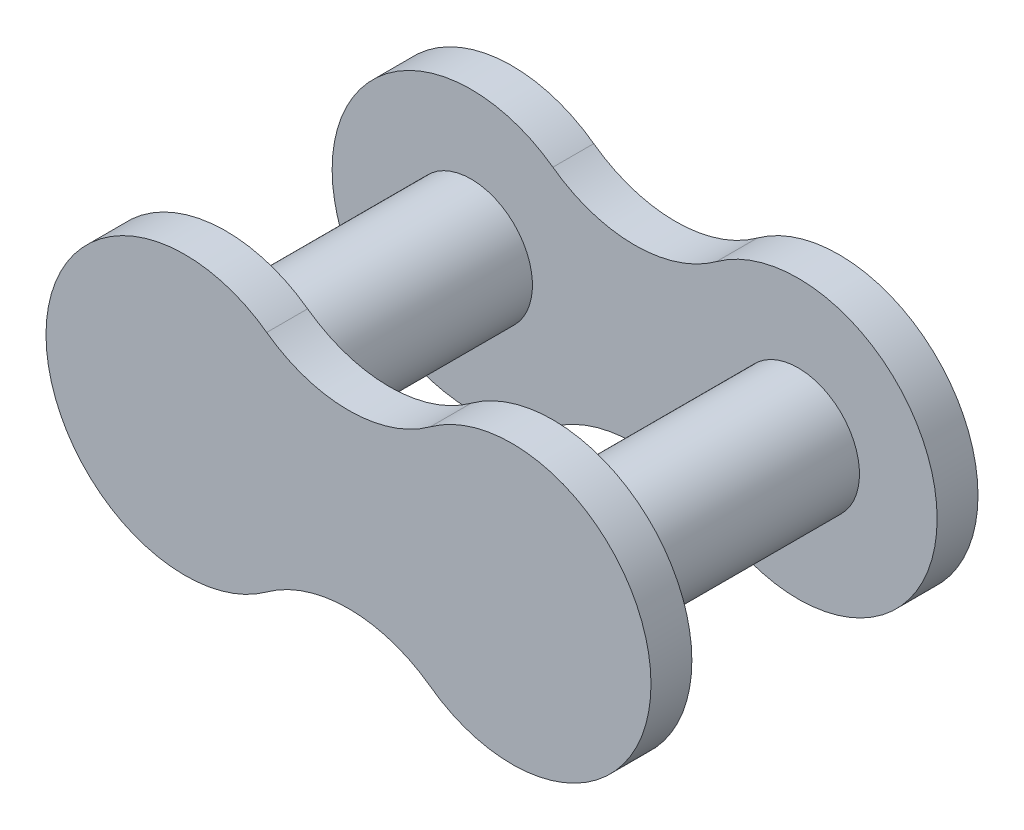
ISO-10303-21;
HEADER;
FILE_DESCRIPTION(('STEP AP214'),'2;1');
FILE_NAME('part.step','',(''),(''),'','','');
FILE_SCHEMA(('AUTOMOTIVE_DESIGN { 1 0 10303 214 1 1 1 1 }'));
ENDSEC;
DATA;
#1=APPLICATION_CONTEXT('core data for automotive mechanical design processes');
#2=APPLICATION_PROTOCOL_DEFINITION('international standard','automotive_design',2000,#1);
#3=PRODUCT_CONTEXT('',#1,'mechanical');
#4=PRODUCT('Part','Part','',(#3));
#5=PRODUCT_RELATED_PRODUCT_CATEGORY('part','',(#4));
#6=PRODUCT_DEFINITION_FORMATION('','',#4);
#7=PRODUCT_DEFINITION_CONTEXT('part definition',#1,'design');
#8=PRODUCT_DEFINITION('design','',#6,#7);
#9=PRODUCT_DEFINITION_SHAPE('','',#8);
#10=(LENGTH_UNIT() NAMED_UNIT(*) SI_UNIT(.MILLI.,.METRE.));
#11=(NAMED_UNIT(*) PLANE_ANGLE_UNIT() SI_UNIT($,.RADIAN.));
#12=(NAMED_UNIT(*) SI_UNIT($,.STERADIAN.) SOLID_ANGLE_UNIT());
#13=UNCERTAINTY_MEASURE_WITH_UNIT(LENGTH_MEASURE(1.E-05),#10,'distance_accuracy_value','');
#14=(GEOMETRIC_REPRESENTATION_CONTEXT(3) GLOBAL_UNCERTAINTY_ASSIGNED_CONTEXT((#13)) GLOBAL_UNIT_ASSIGNED_CONTEXT((#10,
#11,#12)) REPRESENTATION_CONTEXT('',''));
#15=CARTESIAN_POINT('',(0.,0.,0.));
#16=DIRECTION('',(0.,0.,1.));
#17=DIRECTION('',(1.,0.,0.));
#18=AXIS2_PLACEMENT_3D('',#15,#16,#17);
#19=CARTESIAN_POINT('',(9.525,-4.36490334944544,-0.79375));
#20=DIRECTION('',(0.,0.,1.));
#21=DIRECTION('',(1.,0.,0.));
#22=AXIS2_PLACEMENT_3D('',#19,#20,#21);
#23=CYLINDRICAL_SURFACE('',#22,2.69875);
#24=CARTESIAN_POINT('',(9.525,-4.36490334944544,0.));
#25=DIRECTION('',(0.,0.,-1.));
#26=DIRECTION('',(-1.,0.,0.));
#27=AXIS2_PLACEMENT_3D('',#24,#25,#26);
#28=CIRCLE('',#27,2.69875);
#29=CARTESIAN_POINT('',(11.1125,-2.18245167472272,0.));
#30=VERTEX_POINT('',#29);
#31=CARTESIAN_POINT('',(7.9375,-2.18245167472272,0.));
#32=VERTEX_POINT('',#31);
#33=EDGE_CURVE('E152',#30,#32,#28,.F.);
#34=ORIENTED_EDGE('',*,*,#33,.T.);
#35=DIRECTION('',(0.,0.,1.));
#36=VECTOR('',#35,1.);
#37=CARTESIAN_POINT('',(7.9375,-2.18245167472272,-0.79375));
#38=LINE('',#37,#36);
#39=CARTESIAN_POINT('',(7.9375,-2.18245167472272,-0.79375));
#40=VERTEX_POINT('',#39);
#41=EDGE_CURVE('E11',#40,#32,#38,.T.);
#42=ORIENTED_EDGE('',*,*,#41,.F.);
#43=CARTESIAN_POINT('',(9.525,-4.36490334944544,-0.79375));
#44=DIRECTION('',(0.,0.,-1.));
#45=DIRECTION('',(-1.,0.,0.));
#46=AXIS2_PLACEMENT_3D('',#43,#44,#45);
#47=CIRCLE('',#46,2.69875);
#48=CARTESIAN_POINT('',(11.1125,-2.18245167472272,-0.79375));
#49=VERTEX_POINT('',#48);
#50=EDGE_CURVE('E153',#49,#40,#47,.F.);
#51=ORIENTED_EDGE('',*,*,#50,.F.);
#52=DIRECTION('',(0.,0.,1.));
#53=VECTOR('',#52,1.);
#54=CARTESIAN_POINT('',(11.1125,-2.18245167472272,-0.79375));
#55=LINE('',#54,#53);
#56=EDGE_CURVE('E161',#49,#30,#55,.T.);
#57=ORIENTED_EDGE('',*,*,#56,.T.);
#58=EDGE_LOOP('',(#34,#42,#51,#57));
#59=FACE_BOUND('',#58,.T.);
#60=ADVANCED_FACE('F32',(#59),#23,.F.);
#61=CARTESIAN_POINT('',(6.35,0.,-0.79375));
#62=DIRECTION('',(0.,0.,1.));
#63=DIRECTION('',(1.,0.,0.));
#64=AXIS2_PLACEMENT_3D('',#61,#62,#63);
#65=CYLINDRICAL_SURFACE('',#64,2.69875);
#66=CARTESIAN_POINT('',(6.35,0.,0.));
#67=DIRECTION('',(0.,0.,-1.));
#68=DIRECTION('',(-1.,0.,0.));
#69=AXIS2_PLACEMENT_3D('',#66,#67,#68);
#70=CIRCLE('',#69,2.69875);
#71=CARTESIAN_POINT('',(7.9375,2.18245167472272,0.));
#72=VERTEX_POINT('',#71);
#73=EDGE_CURVE('E164',#32,#72,#70,.T.);
#74=ORIENTED_EDGE('',*,*,#73,.T.);
#75=DIRECTION('',(0.,0.,1.));
#76=VECTOR('',#75,1.);
#77=CARTESIAN_POINT('',(7.9375,2.18245167472272,-0.79375));
#78=LINE('',#77,#76);
#79=CARTESIAN_POINT('',(7.9375,2.18245167472272,-0.79375));
#80=VERTEX_POINT('',#79);
#81=EDGE_CURVE('E40',#80,#72,#78,.T.);
#82=ORIENTED_EDGE('',*,*,#81,.F.);
#83=CARTESIAN_POINT('',(6.35,0.,-0.79375));
#84=DIRECTION('',(0.,0.,-1.));
#85=DIRECTION('',(-1.,0.,0.));
#86=AXIS2_PLACEMENT_3D('',#83,#84,#85);
#87=CIRCLE('',#86,2.69875);
#88=EDGE_CURVE('E75',#40,#80,#87,.T.);
#89=ORIENTED_EDGE('',*,*,#88,.F.);
#90=ORIENTED_EDGE('',*,*,#41,.T.);
#91=EDGE_LOOP('',(#74,#82,#89,#90));
#92=FACE_BOUND('',#91,.T.);
#93=ADVANCED_FACE('F177',(#92),#65,.T.);
#94=CARTESIAN_POINT('',(9.525,4.36490334944544,-0.79375));
#95=DIRECTION('',(0.,0.,1.));
#96=DIRECTION('',(1.,0.,0.));
#97=AXIS2_PLACEMENT_3D('',#94,#95,#96);
#98=CYLINDRICAL_SURFACE('',#97,2.69875);
#99=CARTESIAN_POINT('',(9.525,4.36490334944544,0.));
#100=DIRECTION('',(0.,0.,-1.));
#101=DIRECTION('',(-1.,0.,0.));
#102=AXIS2_PLACEMENT_3D('',#99,#100,#101);
#103=CIRCLE('',#102,2.69875);
#104=CARTESIAN_POINT('',(11.1125,2.18245167472272,0.));
#105=VERTEX_POINT('',#104);
#106=EDGE_CURVE('E167',#105,#72,#103,.T.);
#107=ORIENTED_EDGE('',*,*,#106,.F.);
#108=DIRECTION('',(0.,0.,1.));
#109=VECTOR('',#108,1.);
#110=CARTESIAN_POINT('',(11.1125,2.18245167472272,-0.79375));
#111=LINE('',#110,#109);
#112=CARTESIAN_POINT('',(11.1125,2.18245167472272,-0.79375));
#113=VERTEX_POINT('',#112);
#114=EDGE_CURVE('E65',#113,#105,#111,.T.);
#115=ORIENTED_EDGE('',*,*,#114,.F.);
#116=CARTESIAN_POINT('',(9.525,4.36490334944544,-0.79375));
#117=DIRECTION('',(0.,0.,-1.));
#118=DIRECTION('',(-1.,0.,0.));
#119=AXIS2_PLACEMENT_3D('',#116,#117,#118);
#120=CIRCLE('',#119,2.69875);
#121=EDGE_CURVE('E157',#113,#80,#120,.T.);
#122=ORIENTED_EDGE('',*,*,#121,.T.);
#123=ORIENTED_EDGE('',*,*,#81,.T.);
#124=EDGE_LOOP('',(#107,#115,#122,#123));
#125=FACE_BOUND('',#124,.T.);
#126=ADVANCED_FACE('F176',(#125),#98,.F.);
#127=CARTESIAN_POINT('',(12.7,0.,-0.79375));
#128=DIRECTION('',(0.,0.,1.));
#129=DIRECTION('',(1.,0.,0.));
#130=AXIS2_PLACEMENT_3D('',#127,#128,#129);
#131=CYLINDRICAL_SURFACE('',#130,2.69875);
#132=CARTESIAN_POINT('',(12.7,0.,0.));
#133=DIRECTION('',(0.,0.,-1.));
#134=DIRECTION('',(-1.,0.,0.));
#135=AXIS2_PLACEMENT_3D('',#132,#133,#134);
#136=CIRCLE('',#135,2.69875);
#137=EDGE_CURVE('E68',#105,#30,#136,.T.);
#138=ORIENTED_EDGE('',*,*,#137,.T.);
#139=ORIENTED_EDGE('',*,*,#56,.F.);
#140=CARTESIAN_POINT('',(12.7,0.,-0.79375));
#141=DIRECTION('',(0.,0.,-1.));
#142=DIRECTION('',(-1.,0.,0.));
#143=AXIS2_PLACEMENT_3D('',#140,#141,#142);
#144=CIRCLE('',#143,2.69875);
#145=EDGE_CURVE('E48',#113,#49,#144,.T.);
#146=ORIENTED_EDGE('',*,*,#145,.F.);
#147=ORIENTED_EDGE('',*,*,#114,.T.);
#148=EDGE_LOOP('',(#138,#139,#146,#147));
#149=FACE_BOUND('',#148,.T.);
#150=ADVANCED_FACE('F185',(#149),#131,.T.);
#151=CARTESIAN_POINT('',(0.,0.,-0.79375));
#152=DIRECTION('',(0.,0.,-1.));
#153=DIRECTION('',(-1.,0.,0.));
#154=AXIS2_PLACEMENT_3D('',#151,#152,#153);
#155=PLANE('',#154);
#156=ORIENTED_EDGE('',*,*,#50,.T.);
#157=ORIENTED_EDGE('',*,*,#88,.T.);
#158=ORIENTED_EDGE('',*,*,#121,.F.);
#159=ORIENTED_EDGE('',*,*,#145,.T.);
#160=EDGE_LOOP('',(#156,#157,#158,#159));
#161=FACE_BOUND('',#160,.T.);
#162=ADVANCED_FACE('F186',(#161),#155,.T.);
#163=CARTESIAN_POINT('',(0.,0.,0.));
#164=DIRECTION('',(0.,0.,-1.));
#165=DIRECTION('',(-1.,0.,0.));
#166=AXIS2_PLACEMENT_3D('',#163,#164,#165);
#167=PLANE('',#166);
#168=ORIENTED_EDGE('',*,*,#33,.F.);
#169=ORIENTED_EDGE('',*,*,#137,.F.);
#170=ORIENTED_EDGE('',*,*,#106,.T.);
#171=ORIENTED_EDGE('',*,*,#73,.F.);
#172=EDGE_LOOP('',(#168,#169,#170,#171));
#173=FACE_BOUND('',#172,.T.);
#174=CARTESIAN_POINT('',(12.7,0.,0.));
#175=DIRECTION('',(0.,0.,-1.));
#176=DIRECTION('',(-1.,0.,0.));
#177=AXIS2_PLACEMENT_3D('',#174,#175,#176);
#178=CIRCLE('',#177,1.190625);
#179=CARTESIAN_POINT('',(11.509375,0.,0.));
#180=VERTEX_POINT('',#179);
#181=EDGE_CURVE('E122',#180,#180,#178,.T.);
#182=ORIENTED_EDGE('',*,*,#181,.T.);
#183=EDGE_LOOP('',(#182));
#184=FACE_BOUND('',#183,.T.);
#185=CARTESIAN_POINT('',(6.35,0.,0.));
#186=DIRECTION('',(0.,0.,-1.));
#187=DIRECTION('',(-1.,0.,0.));
#188=AXIS2_PLACEMENT_3D('',#185,#186,#187);
#189=CIRCLE('',#188,1.190625);
#190=CARTESIAN_POINT('',(5.159375,0.,0.));
#191=VERTEX_POINT('',#190);
#192=EDGE_CURVE('E155',#191,#191,#189,.F.);
#193=ORIENTED_EDGE('',*,*,#192,.F.);
#194=EDGE_LOOP('',(#193));
#195=FACE_BOUND('',#194,.T.);
#196=ADVANCED_FACE('F181',(#173,#184,#195),#167,.F.);
#197=CARTESIAN_POINT('',(6.35,0.,2.38125));
#198=DIRECTION('',(0.,0.,-1.));
#199=DIRECTION('',(-1.,0.,0.));
#200=AXIS2_PLACEMENT_3D('',#197,#198,#199);
#201=CYLINDRICAL_SURFACE('',#200,1.190625);
#202=ORIENTED_EDGE('',*,*,#192,.T.);
#203=EDGE_LOOP('',(#202));
#204=FACE_BOUND('',#203,.T.);
#205=CARTESIAN_POINT('',(6.35,0.,4.7625));
#206=DIRECTION('',(0.,0.,-1.));
#207=DIRECTION('',(-1.,0.,0.));
#208=AXIS2_PLACEMENT_3D('',#205,#206,#207);
#209=CIRCLE('',#208,1.190625);
#210=CARTESIAN_POINT('',(5.159375,0.,4.7625));
#211=VERTEX_POINT('',#210);
#212=EDGE_CURVE('E128',#211,#211,#209,.F.);
#213=ORIENTED_EDGE('',*,*,#212,.F.);
#214=EDGE_LOOP('',(#213));
#215=FACE_BOUND('',#214,.T.);
#216=ADVANCED_FACE('F194',(#204,#215),#201,.T.);
#217=CARTESIAN_POINT('',(12.7,0.,2.38125));
#218=DIRECTION('',(0.,0.,-1.));
#219=DIRECTION('',(-1.,0.,0.));
#220=AXIS2_PLACEMENT_3D('',#217,#218,#219);
#221=CYLINDRICAL_SURFACE('',#220,1.190625);
#222=ORIENTED_EDGE('',*,*,#181,.F.);
#223=EDGE_LOOP('',(#222));
#224=FACE_BOUND('',#223,.T.);
#225=CARTESIAN_POINT('',(12.7,0.,4.7625));
#226=DIRECTION('',(0.,0.,-1.));
#227=DIRECTION('',(-1.,0.,0.));
#228=AXIS2_PLACEMENT_3D('',#225,#226,#227);
#229=CIRCLE('',#228,1.190625);
#230=CARTESIAN_POINT('',(11.509375,0.,4.7625));
#231=VERTEX_POINT('',#230);
#232=EDGE_CURVE('E134',#231,#231,#229,.T.);
#233=ORIENTED_EDGE('',*,*,#232,.T.);
#234=EDGE_LOOP('',(#233));
#235=FACE_BOUND('',#234,.T.);
#236=ADVANCED_FACE('F257',(#224,#235),#221,.T.);
#237=CARTESIAN_POINT('',(9.525,-4.36490334944544,5.55625));
#238=DIRECTION('',(0.,0.,-1.));
#239=DIRECTION('',(1.,0.,0.));
#240=AXIS2_PLACEMENT_3D('',#237,#238,#239);
#241=CYLINDRICAL_SURFACE('',#240,2.69875);
#242=CARTESIAN_POINT('',(9.525,-4.36490334944544,4.7625));
#243=DIRECTION('',(0.,0.,-1.));
#244=DIRECTION('',(-1.,0.,0.));
#245=AXIS2_PLACEMENT_3D('',#242,#243,#244);
#246=CIRCLE('',#245,2.69875);
#247=CARTESIAN_POINT('',(11.1125,-2.18245167472272,4.7625));
#248=VERTEX_POINT('',#247);
#249=CARTESIAN_POINT('',(7.9375,-2.18245167472272,4.7625));
#250=VERTEX_POINT('',#249);
#251=EDGE_CURVE('E139',#248,#250,#246,.F.);
#252=ORIENTED_EDGE('',*,*,#251,.F.);
#253=DIRECTION('',(0.,0.,-1.));
#254=VECTOR('',#253,1.);
#255=CARTESIAN_POINT('',(11.1125,-2.18245167472272,5.55625));
#256=LINE('',#255,#254);
#257=CARTESIAN_POINT('',(11.1125,-2.18245167472272,5.55625));
#258=VERTEX_POINT('',#257);
#259=EDGE_CURVE('E127',#258,#248,#256,.T.);
#260=ORIENTED_EDGE('',*,*,#259,.F.);
#261=CARTESIAN_POINT('',(9.525,-4.36490334944544,5.55625));
#262=DIRECTION('',(0.,0.,-1.));
#263=DIRECTION('',(-1.,0.,0.));
#264=AXIS2_PLACEMENT_3D('',#261,#262,#263);
#265=CIRCLE('',#264,2.69875);
#266=CARTESIAN_POINT('',(7.9375,-2.18245167472272,5.55625));
#267=VERTEX_POINT('',#266);
#268=EDGE_CURVE('E106',#258,#267,#265,.F.);
#269=ORIENTED_EDGE('',*,*,#268,.T.);
#270=DIRECTION('',(0.,0.,-1.));
#271=VECTOR('',#270,1.);
#272=CARTESIAN_POINT('',(7.9375,-2.18245167472272,5.55625));
#273=LINE('',#272,#271);
#274=EDGE_CURVE('E115',#267,#250,#273,.T.);
#275=ORIENTED_EDGE('',*,*,#274,.T.);
#276=EDGE_LOOP('',(#252,#260,#269,#275));
#277=FACE_BOUND('',#276,.T.);
#278=ADVANCED_FACE('F125',(#277),#241,.F.);
#279=CARTESIAN_POINT('',(6.35,0.,5.55625));
#280=DIRECTION('',(0.,0.,-1.));
#281=DIRECTION('',(1.,0.,0.));
#282=AXIS2_PLACEMENT_3D('',#279,#280,#281);
#283=CYLINDRICAL_SURFACE('',#282,2.69875);
#284=CARTESIAN_POINT('',(6.35,0.,4.7625));
#285=DIRECTION('',(0.,0.,-1.));
#286=DIRECTION('',(-1.,0.,0.));
#287=AXIS2_PLACEMENT_3D('',#284,#285,#286);
#288=CIRCLE('',#287,2.69875);
#289=CARTESIAN_POINT('',(7.9375,2.18245167472272,4.7625));
#290=VERTEX_POINT('',#289);
#291=EDGE_CURVE('E118',#250,#290,#288,.T.);
#292=ORIENTED_EDGE('',*,*,#291,.F.);
#293=ORIENTED_EDGE('',*,*,#274,.F.);
#294=CARTESIAN_POINT('',(6.35,0.,5.55625));
#295=DIRECTION('',(0.,0.,-1.));
#296=DIRECTION('',(-1.,0.,0.));
#297=AXIS2_PLACEMENT_3D('',#294,#295,#296);
#298=CIRCLE('',#297,2.69875);
#299=CARTESIAN_POINT('',(7.9375,2.18245167472272,5.55625));
#300=VERTEX_POINT('',#299);
#301=EDGE_CURVE('E102',#267,#300,#298,.T.);
#302=ORIENTED_EDGE('',*,*,#301,.T.);
#303=DIRECTION('',(0.,0.,-1.));
#304=VECTOR('',#303,1.);
#305=CARTESIAN_POINT('',(7.9375,2.18245167472272,5.55625));
#306=LINE('',#305,#304);
#307=EDGE_CURVE('E123',#300,#290,#306,.T.);
#308=ORIENTED_EDGE('',*,*,#307,.T.);
#309=EDGE_LOOP('',(#292,#293,#302,#308));
#310=FACE_BOUND('',#309,.T.);
#311=ADVANCED_FACE('F116',(#310),#283,.T.);
#312=CARTESIAN_POINT('',(9.525,4.36490334944544,5.55625));
#313=DIRECTION('',(0.,0.,-1.));
#314=DIRECTION('',(1.,0.,0.));
#315=AXIS2_PLACEMENT_3D('',#312,#313,#314);
#316=CYLINDRICAL_SURFACE('',#315,2.69875);
#317=CARTESIAN_POINT('',(9.525,4.36490334944544,4.7625));
#318=DIRECTION('',(0.,0.,-1.));
#319=DIRECTION('',(-1.,0.,0.));
#320=AXIS2_PLACEMENT_3D('',#317,#318,#319);
#321=CIRCLE('',#320,2.69875);
#322=CARTESIAN_POINT('',(11.1125,2.18245167472272,4.7625));
#323=VERTEX_POINT('',#322);
#324=EDGE_CURVE('E142',#323,#290,#321,.T.);
#325=ORIENTED_EDGE('',*,*,#324,.T.);
#326=ORIENTED_EDGE('',*,*,#307,.F.);
#327=CARTESIAN_POINT('',(9.525,4.36490334944544,5.55625));
#328=DIRECTION('',(0.,0.,-1.));
#329=DIRECTION('',(-1.,0.,0.));
#330=AXIS2_PLACEMENT_3D('',#327,#328,#329);
#331=CIRCLE('',#330,2.69875);
#332=CARTESIAN_POINT('',(11.1125,2.18245167472272,5.55625));
#333=VERTEX_POINT('',#332);
#334=EDGE_CURVE('E109',#333,#300,#331,.T.);
#335=ORIENTED_EDGE('',*,*,#334,.F.);
#336=DIRECTION('',(0.,0.,-1.));
#337=VECTOR('',#336,1.);
#338=CARTESIAN_POINT('',(11.1125,2.18245167472272,5.55625));
#339=LINE('',#338,#337);
#340=EDGE_CURVE('E146',#333,#323,#339,.T.);
#341=ORIENTED_EDGE('',*,*,#340,.T.);
#342=EDGE_LOOP('',(#325,#326,#335,#341));
#343=FACE_BOUND('',#342,.T.);
#344=ADVANCED_FACE('F285',(#343),#316,.F.);
#345=CARTESIAN_POINT('',(12.7,0.,5.55625));
#346=DIRECTION('',(0.,0.,-1.));
#347=DIRECTION('',(1.,0.,0.));
#348=AXIS2_PLACEMENT_3D('',#345,#346,#347);
#349=CYLINDRICAL_SURFACE('',#348,2.69875);
#350=CARTESIAN_POINT('',(12.7,0.,4.7625));
#351=DIRECTION('',(0.,0.,-1.));
#352=DIRECTION('',(-1.,0.,0.));
#353=AXIS2_PLACEMENT_3D('',#350,#351,#352);
#354=CIRCLE('',#353,2.69875);
#355=EDGE_CURVE('E131',#323,#248,#354,.T.);
#356=ORIENTED_EDGE('',*,*,#355,.F.);
#357=ORIENTED_EDGE('',*,*,#340,.F.);
#358=CARTESIAN_POINT('',(12.7,0.,5.55625));
#359=DIRECTION('',(0.,0.,-1.));
#360=DIRECTION('',(-1.,0.,0.));
#361=AXIS2_PLACEMENT_3D('',#358,#359,#360);
#362=CIRCLE('',#361,2.69875);
#363=EDGE_CURVE('E137',#333,#258,#362,.T.);
#364=ORIENTED_EDGE('',*,*,#363,.T.);
#365=ORIENTED_EDGE('',*,*,#259,.T.);
#366=EDGE_LOOP('',(#356,#357,#364,#365));
#367=FACE_BOUND('',#366,.T.);
#368=ADVANCED_FACE('F293',(#367),#349,.T.);
#369=CARTESIAN_POINT('',(0.,0.,5.55625));
#370=DIRECTION('',(0.,0.,1.));
#371=DIRECTION('',(-1.,0.,0.));
#372=AXIS2_PLACEMENT_3D('',#369,#370,#371);
#373=PLANE('',#372);
#374=ORIENTED_EDGE('',*,*,#268,.F.);
#375=ORIENTED_EDGE('',*,*,#363,.F.);
#376=ORIENTED_EDGE('',*,*,#334,.T.);
#377=ORIENTED_EDGE('',*,*,#301,.F.);
#378=EDGE_LOOP('',(#374,#375,#376,#377));
#379=FACE_BOUND('',#378,.T.);
#380=ADVANCED_FACE('F104',(#379),#373,.T.);
#381=CARTESIAN_POINT('',(0.,0.,4.7625));
#382=DIRECTION('',(0.,0.,1.));
#383=DIRECTION('',(-1.,0.,0.));
#384=AXIS2_PLACEMENT_3D('',#381,#382,#383);
#385=PLANE('',#384);
#386=ORIENTED_EDGE('',*,*,#251,.T.);
#387=ORIENTED_EDGE('',*,*,#291,.T.);
#388=ORIENTED_EDGE('',*,*,#324,.F.);
#389=ORIENTED_EDGE('',*,*,#355,.T.);
#390=EDGE_LOOP('',(#386,#387,#388,#389));
#391=FACE_BOUND('',#390,.T.);
#392=ORIENTED_EDGE('',*,*,#232,.F.);
#393=EDGE_LOOP('',(#392));
#394=FACE_BOUND('',#393,.T.);
#395=ORIENTED_EDGE('',*,*,#212,.T.);
#396=EDGE_LOOP('',(#395));
#397=FACE_BOUND('',#396,.T.);
#398=ADVANCED_FACE('F311',(#391,#394,#397),#385,.F.);
#399=CLOSED_SHELL('',(#60,#93,#126,#150,#162,#196,#216,#236,#278,#311,#344,#368,#380,#398));
#400=MANIFOLD_SOLID_BREP('B2',#399);
#401=ADVANCED_BREP_SHAPE_REPRESENTATION('',(#18,#400),#14);
#402=SHAPE_DEFINITION_REPRESENTATION(#9,#401);
ENDSEC;
END-ISO-10303-21;
